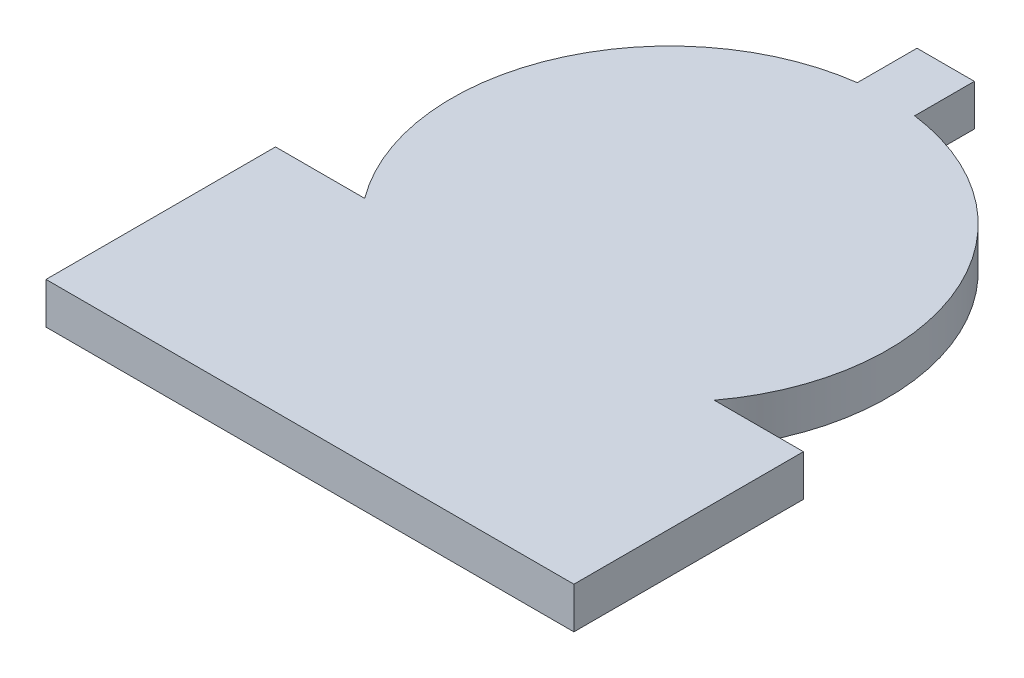
ISO-10303-21;
HEADER;
FILE_DESCRIPTION(('STEP AP214'),'2;1');
FILE_NAME('part.step','',(''),(''),'','','');
FILE_SCHEMA(('AUTOMOTIVE_DESIGN { 1 0 10303 214 1 1 1 1 }'));
ENDSEC;
DATA;
#1=APPLICATION_CONTEXT('core data for automotive mechanical design processes');
#2=APPLICATION_PROTOCOL_DEFINITION('international standard','automotive_design',2000,#1);
#3=PRODUCT_CONTEXT('',#1,'mechanical');
#4=PRODUCT('Part','Part','',(#3));
#5=PRODUCT_RELATED_PRODUCT_CATEGORY('part','',(#4));
#6=PRODUCT_DEFINITION_FORMATION('','',#4);
#7=PRODUCT_DEFINITION_CONTEXT('part definition',#1,'design');
#8=PRODUCT_DEFINITION('design','',#6,#7);
#9=PRODUCT_DEFINITION_SHAPE('','',#8);
#10=(LENGTH_UNIT() NAMED_UNIT(*) SI_UNIT(.MILLI.,.METRE.));
#11=(NAMED_UNIT(*) PLANE_ANGLE_UNIT() SI_UNIT($,.RADIAN.));
#12=(NAMED_UNIT(*) SI_UNIT($,.STERADIAN.) SOLID_ANGLE_UNIT());
#13=UNCERTAINTY_MEASURE_WITH_UNIT(LENGTH_MEASURE(1.E-05),#10,'distance_accuracy_value','');
#14=(GEOMETRIC_REPRESENTATION_CONTEXT(3) GLOBAL_UNCERTAINTY_ASSIGNED_CONTEXT((#13)) GLOBAL_UNIT_ASSIGNED_CONTEXT((#10,
#11,#12)) REPRESENTATION_CONTEXT('',''));
#15=CARTESIAN_POINT('',(0.,0.,0.));
#16=DIRECTION('',(0.,0.,1.));
#17=DIRECTION('',(1.,0.,0.));
#18=AXIS2_PLACEMENT_3D('',#15,#16,#17);
#19=CARTESIAN_POINT('',(0.,4.572,0.));
#20=DIRECTION('',(0.,-1.,0.));
#21=DIRECTION('',(0.,0.,-1.));
#22=AXIS2_PLACEMENT_3D('',#19,#20,#21);
#23=CYLINDRICAL_SURFACE('',#22,24.13);
#24=CARTESIAN_POINT('',(0.,0.,0.));
#25=DIRECTION('',(0.,1.,0.));
#26=DIRECTION('',(0.,0.,1.));
#27=AXIS2_PLACEMENT_3D('',#24,#25,#26);
#28=CIRCLE('',#27,24.13);
#29=CARTESIAN_POINT('',(-3.175,0.,-23.9202064163334));
#30=VERTEX_POINT('',#29);
#31=CARTESIAN_POINT('',(-19.341279758626,0.,14.4281598722277));
#32=VERTEX_POINT('',#31);
#33=EDGE_CURVE('E149',#30,#32,#28,.T.);
#34=ORIENTED_EDGE('',*,*,#33,.T.);
#35=DIRECTION('',(0.,-1.,0.));
#36=VECTOR('',#35,1.);
#37=CARTESIAN_POINT('',(-19.341279758626,4.572,14.4281598722277));
#38=LINE('',#37,#36);
#39=CARTESIAN_POINT('',(-19.341279758626,4.572,14.4281598722277));
#40=VERTEX_POINT('',#39);
#41=EDGE_CURVE('E11',#40,#32,#38,.T.);
#42=ORIENTED_EDGE('',*,*,#41,.F.);
#43=CARTESIAN_POINT('',(0.,4.572,0.));
#44=DIRECTION('',(0.,1.,0.));
#45=DIRECTION('',(0.,0.,1.));
#46=AXIS2_PLACEMENT_3D('',#43,#44,#45);
#47=CIRCLE('',#46,24.13);
#48=CARTESIAN_POINT('',(-3.175,4.572,-23.9202064163334));
#49=VERTEX_POINT('',#48);
#50=EDGE_CURVE('E167',#49,#40,#47,.T.);
#51=ORIENTED_EDGE('',*,*,#50,.F.);
#52=DIRECTION('',(0.,-1.,0.));
#53=VECTOR('',#52,1.);
#54=CARTESIAN_POINT('',(-3.175,4.572,-23.9202064163334));
#55=LINE('',#54,#53);
#56=EDGE_CURVE('E145',#49,#30,#55,.T.);
#57=ORIENTED_EDGE('',*,*,#56,.T.);
#58=EDGE_LOOP('',(#34,#42,#51,#57));
#59=FACE_BOUND('',#58,.T.);
#60=ADVANCED_FACE('F41',(#59),#23,.T.);
#61=CARTESIAN_POINT('',(-29.21,4.572,14.4281598722277));
#62=DIRECTION('',(0.,0.,1.));
#63=DIRECTION('',(1.,0.,0.));
#64=AXIS2_PLACEMENT_3D('',#61,#62,#63);
#65=PLANE('',#64);
#66=DIRECTION('',(-1.,0.,0.));
#67=VECTOR('',#66,1.);
#68=CARTESIAN_POINT('',(-29.21,0.,14.4281598722277));
#69=LINE('',#68,#67);
#70=CARTESIAN_POINT('',(-29.21,0.,14.4281598722277));
#71=VERTEX_POINT('',#70);
#72=EDGE_CURVE('E152',#32,#71,#69,.T.);
#73=ORIENTED_EDGE('',*,*,#72,.T.);
#74=DIRECTION('',(0.,-1.,0.));
#75=VECTOR('',#74,1.);
#76=CARTESIAN_POINT('',(-29.21,4.572,14.4281598722277));
#77=LINE('',#76,#75);
#78=CARTESIAN_POINT('',(-29.21,4.572,14.4281598722277));
#79=VERTEX_POINT('',#78);
#80=EDGE_CURVE('E49',#79,#71,#77,.T.);
#81=ORIENTED_EDGE('',*,*,#80,.F.);
#82=DIRECTION('',(-1.,0.,0.));
#83=VECTOR('',#82,1.);
#84=CARTESIAN_POINT('',(-29.21,4.572,14.4281598722277));
#85=LINE('',#84,#83);
#86=EDGE_CURVE('E106',#40,#79,#85,.T.);
#87=ORIENTED_EDGE('',*,*,#86,.F.);
#88=ORIENTED_EDGE('',*,*,#41,.T.);
#89=EDGE_LOOP('',(#73,#81,#87,#88));
#90=FACE_BOUND('',#89,.T.);
#91=ADVANCED_FACE('F216',(#90),#65,.F.);
#92=CARTESIAN_POINT('',(-29.21,4.572,14.4281598722277));
#93=DIRECTION('',(1.,0.,0.));
#94=DIRECTION('',(0.,0.,-1.));
#95=AXIS2_PLACEMENT_3D('',#92,#93,#94);
#96=PLANE('',#95);
#97=DIRECTION('',(0.,0.,1.));
#98=VECTOR('',#97,1.);
#99=CARTESIAN_POINT('',(-29.21,0.,14.4281598722277));
#100=LINE('',#99,#98);
#101=CARTESIAN_POINT('',(-29.21,0.,39.8281598722277));
#102=VERTEX_POINT('',#101);
#103=EDGE_CURVE('E154',#71,#102,#100,.T.);
#104=ORIENTED_EDGE('',*,*,#103,.T.);
#105=DIRECTION('',(0.,-1.,0.));
#106=VECTOR('',#105,1.);
#107=CARTESIAN_POINT('',(-29.21,4.572,39.8281598722277));
#108=LINE('',#107,#106);
#109=CARTESIAN_POINT('',(-29.21,4.572,39.8281598722277));
#110=VERTEX_POINT('',#109);
#111=EDGE_CURVE('E180',#110,#102,#108,.T.);
#112=ORIENTED_EDGE('',*,*,#111,.F.);
#113=DIRECTION('',(0.,0.,1.));
#114=VECTOR('',#113,1.);
#115=CARTESIAN_POINT('',(-29.21,4.572,14.4281598722277));
#116=LINE('',#115,#114);
#117=EDGE_CURVE('E188',#79,#110,#116,.T.);
#118=ORIENTED_EDGE('',*,*,#117,.F.);
#119=ORIENTED_EDGE('',*,*,#80,.T.);
#120=EDGE_LOOP('',(#104,#112,#118,#119));
#121=FACE_BOUND('',#120,.T.);
#122=ADVANCED_FACE('F186',(#121),#96,.F.);
#123=CARTESIAN_POINT('',(-29.21,4.572,39.8281598722277));
#124=DIRECTION('',(0.,0.,-1.));
#125=DIRECTION('',(-1.,0.,0.));
#126=AXIS2_PLACEMENT_3D('',#123,#124,#125);
#127=PLANE('',#126);
#128=DIRECTION('',(1.,0.,0.));
#129=VECTOR('',#128,1.);
#130=CARTESIAN_POINT('',(-29.21,0.,39.8281598722277));
#131=LINE('',#130,#129);
#132=CARTESIAN_POINT('',(29.21,0.,39.8281598722277));
#133=VERTEX_POINT('',#132);
#134=EDGE_CURVE('E156',#102,#133,#131,.T.);
#135=ORIENTED_EDGE('',*,*,#134,.T.);
#136=DIRECTION('',(0.,-1.,0.));
#137=VECTOR('',#136,1.);
#138=CARTESIAN_POINT('',(29.21,4.572,39.8281598722277));
#139=LINE('',#138,#137);
#140=CARTESIAN_POINT('',(29.21,4.572,39.8281598722277));
#141=VERTEX_POINT('',#140);
#142=EDGE_CURVE('E177',#141,#133,#139,.T.);
#143=ORIENTED_EDGE('',*,*,#142,.F.);
#144=DIRECTION('',(1.,0.,0.));
#145=VECTOR('',#144,1.);
#146=CARTESIAN_POINT('',(-29.21,4.572,39.8281598722277));
#147=LINE('',#146,#145);
#148=EDGE_CURVE('E206',#110,#141,#147,.T.);
#149=ORIENTED_EDGE('',*,*,#148,.F.);
#150=ORIENTED_EDGE('',*,*,#111,.T.);
#151=EDGE_LOOP('',(#135,#143,#149,#150));
#152=FACE_BOUND('',#151,.T.);
#153=ADVANCED_FACE('F197',(#152),#127,.F.);
#154=CARTESIAN_POINT('',(29.21,4.572,14.4281598722277));
#155=DIRECTION('',(-1.,0.,0.));
#156=DIRECTION('',(0.,0.,1.));
#157=AXIS2_PLACEMENT_3D('',#154,#155,#156);
#158=PLANE('',#157);
#159=DIRECTION('',(0.,0.,-1.));
#160=VECTOR('',#159,1.);
#161=CARTESIAN_POINT('',(29.21,0.,14.4281598722277));
#162=LINE('',#161,#160);
#163=CARTESIAN_POINT('',(29.21,0.,14.4281598722277));
#164=VERTEX_POINT('',#163);
#165=EDGE_CURVE('E158',#133,#164,#162,.T.);
#166=ORIENTED_EDGE('',*,*,#165,.T.);
#167=DIRECTION('',(0.,-1.,0.));
#168=VECTOR('',#167,1.);
#169=CARTESIAN_POINT('',(29.21,4.572,14.4281598722277));
#170=LINE('',#169,#168);
#171=CARTESIAN_POINT('',(29.21,4.572,14.4281598722277));
#172=VERTEX_POINT('',#171);
#173=EDGE_CURVE('E174',#172,#164,#170,.T.);
#174=ORIENTED_EDGE('',*,*,#173,.F.);
#175=DIRECTION('',(0.,0.,-1.));
#176=VECTOR('',#175,1.);
#177=CARTESIAN_POINT('',(29.21,4.572,14.4281598722277));
#178=LINE('',#177,#176);
#179=EDGE_CURVE('E203',#141,#172,#178,.T.);
#180=ORIENTED_EDGE('',*,*,#179,.F.);
#181=ORIENTED_EDGE('',*,*,#142,.T.);
#182=EDGE_LOOP('',(#166,#174,#180,#181));
#183=FACE_BOUND('',#182,.T.);
#184=ADVANCED_FACE('F201',(#183),#158,.F.);
#185=CARTESIAN_POINT('',(19.341279758626,4.572,14.4281598722277));
#186=DIRECTION('',(0.,0.,1.));
#187=DIRECTION('',(1.,0.,0.));
#188=AXIS2_PLACEMENT_3D('',#185,#186,#187);
#189=PLANE('',#188);
#190=DIRECTION('',(-1.,0.,0.));
#191=VECTOR('',#190,1.);
#192=CARTESIAN_POINT('',(19.341279758626,0.,14.4281598722277));
#193=LINE('',#192,#191);
#194=CARTESIAN_POINT('',(19.341279758626,0.,14.4281598722277));
#195=VERTEX_POINT('',#194);
#196=EDGE_CURVE('E160',#164,#195,#193,.T.);
#197=ORIENTED_EDGE('',*,*,#196,.T.);
#198=DIRECTION('',(0.,-1.,0.));
#199=VECTOR('',#198,1.);
#200=CARTESIAN_POINT('',(19.341279758626,4.572,14.4281598722277));
#201=LINE('',#200,#199);
#202=CARTESIAN_POINT('',(19.341279758626,4.572,14.4281598722277));
#203=VERTEX_POINT('',#202);
#204=EDGE_CURVE('E171',#203,#195,#201,.T.);
#205=ORIENTED_EDGE('',*,*,#204,.F.);
#206=DIRECTION('',(-1.,0.,0.));
#207=VECTOR('',#206,1.);
#208=CARTESIAN_POINT('',(19.341279758626,4.572,14.4281598722277));
#209=LINE('',#208,#207);
#210=EDGE_CURVE('E205',#172,#203,#209,.T.);
#211=ORIENTED_EDGE('',*,*,#210,.F.);
#212=ORIENTED_EDGE('',*,*,#173,.T.);
#213=EDGE_LOOP('',(#197,#205,#211,#212));
#214=FACE_BOUND('',#213,.T.);
#215=ADVANCED_FACE('F228',(#214),#189,.F.);
#216=CARTESIAN_POINT('',(0.,4.572,0.));
#217=DIRECTION('',(0.,-1.,0.));
#218=DIRECTION('',(0.,0.,-1.));
#219=AXIS2_PLACEMENT_3D('',#216,#217,#218);
#220=CYLINDRICAL_SURFACE('',#219,24.13);
#221=CARTESIAN_POINT('',(0.,0.,0.));
#222=DIRECTION('',(0.,1.,0.));
#223=DIRECTION('',(0.,0.,1.));
#224=AXIS2_PLACEMENT_3D('',#221,#222,#223);
#225=CIRCLE('',#224,24.13);
#226=CARTESIAN_POINT('',(3.175,0.,-23.9202064163334));
#227=VERTEX_POINT('',#226);
#228=EDGE_CURVE('E162',#195,#227,#225,.T.);
#229=ORIENTED_EDGE('',*,*,#228,.T.);
#230=DIRECTION('',(0.,-1.,0.));
#231=VECTOR('',#230,1.);
#232=CARTESIAN_POINT('',(3.175,4.572,-23.9202064163334));
#233=LINE('',#232,#231);
#234=CARTESIAN_POINT('',(3.175,4.572,-23.9202064163334));
#235=VERTEX_POINT('',#234);
#236=EDGE_CURVE('E140',#235,#227,#233,.T.);
#237=ORIENTED_EDGE('',*,*,#236,.F.);
#238=CARTESIAN_POINT('',(0.,4.572,0.));
#239=DIRECTION('',(0.,1.,0.));
#240=DIRECTION('',(0.,0.,1.));
#241=AXIS2_PLACEMENT_3D('',#238,#239,#240);
#242=CIRCLE('',#241,24.13);
#243=EDGE_CURVE('E131',#203,#235,#242,.T.);
#244=ORIENTED_EDGE('',*,*,#243,.F.);
#245=ORIENTED_EDGE('',*,*,#204,.T.);
#246=EDGE_LOOP('',(#229,#237,#244,#245));
#247=FACE_BOUND('',#246,.T.);
#248=ADVANCED_FACE('F231',(#247),#220,.T.);
#249=CARTESIAN_POINT('',(3.175,4.572,-30.5242064163334));
#250=DIRECTION('',(-1.,0.,0.));
#251=DIRECTION('',(0.,0.,1.));
#252=AXIS2_PLACEMENT_3D('',#249,#250,#251);
#253=PLANE('',#252);
#254=DIRECTION('',(0.,0.,-1.));
#255=VECTOR('',#254,1.);
#256=CARTESIAN_POINT('',(3.175,0.,-30.5242064163334));
#257=LINE('',#256,#255);
#258=CARTESIAN_POINT('',(3.175,0.,-30.5242064163334));
#259=VERTEX_POINT('',#258);
#260=EDGE_CURVE('E139',#227,#259,#257,.T.);
#261=ORIENTED_EDGE('',*,*,#260,.T.);
#262=DIRECTION('',(0.,-1.,0.));
#263=VECTOR('',#262,1.);
#264=CARTESIAN_POINT('',(3.175,4.572,-30.5242064163334));
#265=LINE('',#264,#263);
#266=CARTESIAN_POINT('',(3.175,4.572,-30.5242064163334));
#267=VERTEX_POINT('',#266);
#268=EDGE_CURVE('E136',#267,#259,#265,.T.);
#269=ORIENTED_EDGE('',*,*,#268,.F.);
#270=DIRECTION('',(0.,0.,-1.));
#271=VECTOR('',#270,1.);
#272=CARTESIAN_POINT('',(3.175,4.572,-30.5242064163334));
#273=LINE('',#272,#271);
#274=EDGE_CURVE('E125',#235,#267,#273,.T.);
#275=ORIENTED_EDGE('',*,*,#274,.F.);
#276=ORIENTED_EDGE('',*,*,#236,.T.);
#277=EDGE_LOOP('',(#261,#269,#275,#276));
#278=FACE_BOUND('',#277,.T.);
#279=ADVANCED_FACE('F137',(#278),#253,.F.);
#280=CARTESIAN_POINT('',(-3.175,4.572,-30.5242064163334));
#281=DIRECTION('',(0.,0.,1.));
#282=DIRECTION('',(1.,0.,0.));
#283=AXIS2_PLACEMENT_3D('',#280,#281,#282);
#284=PLANE('',#283);
#285=DIRECTION('',(-1.,0.,0.));
#286=VECTOR('',#285,1.);
#287=CARTESIAN_POINT('',(-3.175,0.,-30.5242064163334));
#288=LINE('',#287,#286);
#289=CARTESIAN_POINT('',(-3.175,0.,-30.5242064163334));
#290=VERTEX_POINT('',#289);
#291=EDGE_CURVE('E92',#259,#290,#288,.T.);
#292=ORIENTED_EDGE('',*,*,#291,.T.);
#293=DIRECTION('',(0.,-1.,0.));
#294=VECTOR('',#293,1.);
#295=CARTESIAN_POINT('',(-3.175,4.572,-30.5242064163334));
#296=LINE('',#295,#294);
#297=CARTESIAN_POINT('',(-3.175,4.572,-30.5242064163334));
#298=VERTEX_POINT('',#297);
#299=EDGE_CURVE('E141',#298,#290,#296,.T.);
#300=ORIENTED_EDGE('',*,*,#299,.F.);
#301=DIRECTION('',(-1.,0.,0.));
#302=VECTOR('',#301,1.);
#303=CARTESIAN_POINT('',(-3.175,4.572,-30.5242064163334));
#304=LINE('',#303,#302);
#305=EDGE_CURVE('E129',#267,#298,#304,.T.);
#306=ORIENTED_EDGE('',*,*,#305,.F.);
#307=ORIENTED_EDGE('',*,*,#268,.T.);
#308=EDGE_LOOP('',(#292,#300,#306,#307));
#309=FACE_BOUND('',#308,.T.);
#310=ADVANCED_FACE('F143',(#309),#284,.F.);
#311=CARTESIAN_POINT('',(-3.175,4.572,-30.5242064163334));
#312=DIRECTION('',(1.,0.,0.));
#313=DIRECTION('',(0.,0.,-1.));
#314=AXIS2_PLACEMENT_3D('',#311,#312,#313);
#315=PLANE('',#314);
#316=DIRECTION('',(0.,0.,1.));
#317=VECTOR('',#316,1.);
#318=CARTESIAN_POINT('',(-3.175,0.,-30.5242064163334));
#319=LINE('',#318,#317);
#320=EDGE_CURVE('E98',#290,#30,#319,.T.);
#321=ORIENTED_EDGE('',*,*,#320,.T.);
#322=ORIENTED_EDGE('',*,*,#56,.F.);
#323=DIRECTION('',(0.,0.,1.));
#324=VECTOR('',#323,1.);
#325=CARTESIAN_POINT('',(-3.175,4.572,-30.5242064163334));
#326=LINE('',#325,#324);
#327=EDGE_CURVE('E57',#298,#49,#326,.T.);
#328=ORIENTED_EDGE('',*,*,#327,.F.);
#329=ORIENTED_EDGE('',*,*,#299,.T.);
#330=EDGE_LOOP('',(#321,#322,#328,#329));
#331=FACE_BOUND('',#330,.T.);
#332=ADVANCED_FACE('F240',(#331),#315,.F.);
#333=CARTESIAN_POINT('',(0.,4.572,0.));
#334=DIRECTION('',(0.,1.,0.));
#335=DIRECTION('',(0.,0.,1.));
#336=AXIS2_PLACEMENT_3D('',#333,#334,#335);
#337=PLANE('',#336);
#338=ORIENTED_EDGE('',*,*,#50,.T.);
#339=ORIENTED_EDGE('',*,*,#86,.T.);
#340=ORIENTED_EDGE('',*,*,#117,.T.);
#341=ORIENTED_EDGE('',*,*,#148,.T.);
#342=ORIENTED_EDGE('',*,*,#179,.T.);
#343=ORIENTED_EDGE('',*,*,#210,.T.);
#344=ORIENTED_EDGE('',*,*,#243,.T.);
#345=ORIENTED_EDGE('',*,*,#274,.T.);
#346=ORIENTED_EDGE('',*,*,#305,.T.);
#347=ORIENTED_EDGE('',*,*,#327,.T.);
#348=EDGE_LOOP('',(#338,#339,#340,#341,#342,#343,#344,#345,#346,#347));
#349=FACE_BOUND('',#348,.T.);
#350=ADVANCED_FACE('F127',(#349),#337,.T.);
#351=CARTESIAN_POINT('',(0.,0.,0.));
#352=DIRECTION('',(0.,1.,0.));
#353=DIRECTION('',(0.,0.,1.));
#354=AXIS2_PLACEMENT_3D('',#351,#352,#353);
#355=PLANE('',#354);
#356=ORIENTED_EDGE('',*,*,#33,.F.);
#357=ORIENTED_EDGE('',*,*,#320,.F.);
#358=ORIENTED_EDGE('',*,*,#291,.F.);
#359=ORIENTED_EDGE('',*,*,#260,.F.);
#360=ORIENTED_EDGE('',*,*,#228,.F.);
#361=ORIENTED_EDGE('',*,*,#196,.F.);
#362=ORIENTED_EDGE('',*,*,#165,.F.);
#363=ORIENTED_EDGE('',*,*,#134,.F.);
#364=ORIENTED_EDGE('',*,*,#103,.F.);
#365=ORIENTED_EDGE('',*,*,#72,.F.);
#366=EDGE_LOOP('',(#356,#357,#358,#359,#360,#361,#362,#363,#364,#365));
#367=FACE_BOUND('',#366,.T.);
#368=ADVANCED_FACE('F192',(#367),#355,.F.);
#369=CLOSED_SHELL('',(#60,#91,#122,#153,#184,#215,#248,#279,#310,#332,#350,#368));
#370=MANIFOLD_SOLID_BREP('B2',#369);
#371=ADVANCED_BREP_SHAPE_REPRESENTATION('',(#18,#370),#14);
#372=SHAPE_DEFINITION_REPRESENTATION(#9,#371);
ENDSEC;
END-ISO-10303-21;
